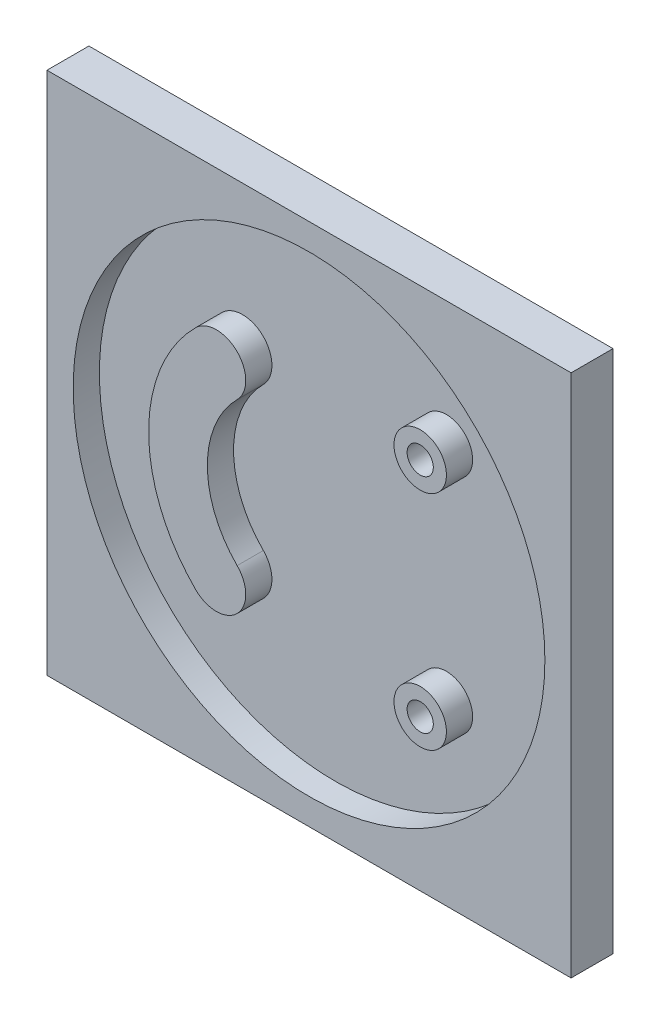
ISO-10303-21;
HEADER;
FILE_DESCRIPTION(('STEP AP214'),'2;1');
FILE_NAME('part.step','',(''),(''),'','','');
FILE_SCHEMA(('AUTOMOTIVE_DESIGN { 1 0 10303 214 1 1 1 1 }'));
ENDSEC;
DATA;
#1=APPLICATION_CONTEXT('core data for automotive mechanical design processes');
#2=APPLICATION_PROTOCOL_DEFINITION('international standard','automotive_design',2000,#1);
#3=PRODUCT_CONTEXT('',#1,'mechanical');
#4=PRODUCT('Part','Part','',(#3));
#5=PRODUCT_RELATED_PRODUCT_CATEGORY('part','',(#4));
#6=PRODUCT_DEFINITION_FORMATION('','',#4);
#7=PRODUCT_DEFINITION_CONTEXT('part definition',#1,'design');
#8=PRODUCT_DEFINITION('design','',#6,#7);
#9=PRODUCT_DEFINITION_SHAPE('','',#8);
#10=(LENGTH_UNIT() NAMED_UNIT(*) SI_UNIT(.MILLI.,.METRE.));
#11=(NAMED_UNIT(*) PLANE_ANGLE_UNIT() SI_UNIT($,.RADIAN.));
#12=(NAMED_UNIT(*) SI_UNIT($,.STERADIAN.) SOLID_ANGLE_UNIT());
#13=UNCERTAINTY_MEASURE_WITH_UNIT(LENGTH_MEASURE(1.E-05),#10,'distance_accuracy_value','');
#14=(GEOMETRIC_REPRESENTATION_CONTEXT(3) GLOBAL_UNCERTAINTY_ASSIGNED_CONTEXT((#13)) GLOBAL_UNIT_ASSIGNED_CONTEXT((#10,
#11,#12)) REPRESENTATION_CONTEXT('',''));
#15=CARTESIAN_POINT('',(0.,0.,0.));
#16=DIRECTION('',(0.,0.,1.));
#17=DIRECTION('',(1.,0.,0.));
#18=AXIS2_PLACEMENT_3D('',#15,#16,#17);
#19=CARTESIAN_POINT('',(0.,0.,10.16));
#20=DIRECTION('',(0.,0.,-1.));
#21=DIRECTION('',(-1.,0.,0.));
#22=AXIS2_PLACEMENT_3D('',#19,#20,#21);
#23=PLANE('',#22);
#24=CARTESIAN_POINT('',(63.5,63.5,10.16));
#25=DIRECTION('',(0.,0.,1.));
#26=DIRECTION('',(1.,0.,0.));
#27=AXIS2_PLACEMENT_3D('',#24,#25,#26);
#28=CIRCLE('',#27,57.15);
#29=CARTESIAN_POINT('',(120.65,63.5,10.16));
#30=VERTEX_POINT('',#29);
#31=EDGE_CURVE('E160',#30,#30,#28,.T.);
#32=ORIENTED_EDGE('',*,*,#31,.F.);
#33=EDGE_LOOP('',(#32));
#34=FACE_BOUND('',#33,.T.);
#35=DIRECTION('',(0.,-1.,0.));
#36=VECTOR('',#35,1.);
#37=CARTESIAN_POINT('',(0.,0.,10.16));
#38=LINE('',#37,#36);
#39=CARTESIAN_POINT('',(0.,127.,10.16));
#40=VERTEX_POINT('',#39);
#41=CARTESIAN_POINT('',(0.,0.,10.16));
#42=VERTEX_POINT('',#41);
#43=EDGE_CURVE('E208',#40,#42,#38,.T.);
#44=ORIENTED_EDGE('',*,*,#43,.T.);
#45=DIRECTION('',(1.,0.,0.));
#46=VECTOR('',#45,1.);
#47=CARTESIAN_POINT('',(0.,0.,10.16));
#48=LINE('',#47,#46);
#49=CARTESIAN_POINT('',(127.,0.,10.16));
#50=VERTEX_POINT('',#49);
#51=EDGE_CURVE('E100',#42,#50,#48,.T.);
#52=ORIENTED_EDGE('',*,*,#51,.T.);
#53=DIRECTION('',(0.,1.,0.));
#54=VECTOR('',#53,1.);
#55=CARTESIAN_POINT('',(127.,0.,10.16));
#56=LINE('',#55,#54);
#57=CARTESIAN_POINT('',(127.,127.,10.16));
#58=VERTEX_POINT('',#57);
#59=EDGE_CURVE('E224',#50,#58,#56,.T.);
#60=ORIENTED_EDGE('',*,*,#59,.T.);
#61=DIRECTION('',(-1.,0.,0.));
#62=VECTOR('',#61,1.);
#63=CARTESIAN_POINT('',(0.,127.,10.16));
#64=LINE('',#63,#62);
#65=EDGE_CURVE('E71',#58,#40,#64,.T.);
#66=ORIENTED_EDGE('',*,*,#65,.T.);
#67=EDGE_LOOP('',(#44,#52,#60,#66));
#68=FACE_BOUND('',#67,.T.);
#69=ADVANCED_FACE('F46',(#34,#68),#23,.F.);
#70=CARTESIAN_POINT('',(0.,0.,0.));
#71=DIRECTION('',(0.,0.,-1.));
#72=DIRECTION('',(-1.,0.,0.));
#73=AXIS2_PLACEMENT_3D('',#70,#71,#72);
#74=PLANE('',#73);
#75=CARTESIAN_POINT('',(90.4407683632075,90.4407683632075,0.));
#76=DIRECTION('',(0.,0.,1.));
#77=DIRECTION('',(1.,0.,0.));
#78=AXIS2_PLACEMENT_3D('',#75,#76,#77);
#79=CIRCLE('',#78,3.175);
#80=CARTESIAN_POINT('',(93.6157683632075,90.4407683632075,0.));
#81=VERTEX_POINT('',#80);
#82=EDGE_CURVE('E337',#81,#81,#79,.T.);
#83=ORIENTED_EDGE('',*,*,#82,.T.);
#84=EDGE_LOOP('',(#83));
#85=FACE_BOUND('',#84,.T.);
#86=CARTESIAN_POINT('',(90.4407683632075,36.5592316367925,0.));
#87=DIRECTION('',(0.,0.,1.));
#88=DIRECTION('',(1.,0.,0.));
#89=AXIS2_PLACEMENT_3D('',#86,#87,#88);
#90=CIRCLE('',#89,3.175);
#91=CARTESIAN_POINT('',(93.6157683632075,36.5592316367925,0.));
#92=VERTEX_POINT('',#91);
#93=EDGE_CURVE('E342',#92,#92,#90,.T.);
#94=ORIENTED_EDGE('',*,*,#93,.T.);
#95=EDGE_LOOP('',(#94));
#96=FACE_BOUND('',#95,.T.);
#97=DIRECTION('',(0.,-1.,0.));
#98=VECTOR('',#97,1.);
#99=CARTESIAN_POINT('',(0.,0.,0.));
#100=LINE('',#99,#98);
#101=CARTESIAN_POINT('',(0.,127.,0.));
#102=VERTEX_POINT('',#101);
#103=CARTESIAN_POINT('',(0.,0.,0.));
#104=VERTEX_POINT('',#103);
#105=EDGE_CURVE('E207',#102,#104,#100,.T.);
#106=ORIENTED_EDGE('',*,*,#105,.F.);
#107=DIRECTION('',(-1.,0.,0.));
#108=VECTOR('',#107,1.);
#109=CARTESIAN_POINT('',(0.,127.,0.));
#110=LINE('',#109,#108);
#111=CARTESIAN_POINT('',(127.,127.,0.));
#112=VERTEX_POINT('',#111);
#113=EDGE_CURVE('E92',#112,#102,#110,.T.);
#114=ORIENTED_EDGE('',*,*,#113,.F.);
#115=DIRECTION('',(0.,1.,0.));
#116=VECTOR('',#115,1.);
#117=CARTESIAN_POINT('',(127.,0.,0.));
#118=LINE('',#117,#116);
#119=CARTESIAN_POINT('',(127.,0.,0.));
#120=VERTEX_POINT('',#119);
#121=EDGE_CURVE('E258',#120,#112,#118,.T.);
#122=ORIENTED_EDGE('',*,*,#121,.F.);
#123=DIRECTION('',(1.,0.,0.));
#124=VECTOR('',#123,1.);
#125=CARTESIAN_POINT('',(0.,0.,0.));
#126=LINE('',#125,#124);
#127=EDGE_CURVE('E251',#104,#120,#126,.T.);
#128=ORIENTED_EDGE('',*,*,#127,.F.);
#129=EDGE_LOOP('',(#106,#114,#122,#128));
#130=FACE_BOUND('',#129,.T.);
#131=ADVANCED_FACE('F285',(#85,#96,#130),#74,.T.);
#132=CARTESIAN_POINT('',(0.,0.,10.16));
#133=DIRECTION('',(1.,0.,0.));
#134=DIRECTION('',(0.,1.,0.));
#135=AXIS2_PLACEMENT_3D('',#132,#133,#134);
#136=PLANE('',#135);
#137=ORIENTED_EDGE('',*,*,#105,.T.);
#138=DIRECTION('',(0.,0.,-1.));
#139=VECTOR('',#138,1.);
#140=CARTESIAN_POINT('',(0.,0.,10.16));
#141=LINE('',#140,#139);
#142=EDGE_CURVE('E55',#42,#104,#141,.T.);
#143=ORIENTED_EDGE('',*,*,#142,.F.);
#144=ORIENTED_EDGE('',*,*,#43,.F.);
#145=DIRECTION('',(0.,0.,-1.));
#146=VECTOR('',#145,1.);
#147=CARTESIAN_POINT('',(0.,127.,10.16));
#148=LINE('',#147,#146);
#149=EDGE_CURVE('E241',#40,#102,#148,.T.);
#150=ORIENTED_EDGE('',*,*,#149,.T.);
#151=EDGE_LOOP('',(#137,#143,#144,#150));
#152=FACE_BOUND('',#151,.T.);
#153=ADVANCED_FACE('F48',(#152),#136,.F.);
#154=CARTESIAN_POINT('',(0.,0.,10.16));
#155=DIRECTION('',(0.,1.,0.));
#156=DIRECTION('',(0.,0.,1.));
#157=AXIS2_PLACEMENT_3D('',#154,#155,#156);
#158=PLANE('',#157);
#159=ORIENTED_EDGE('',*,*,#127,.T.);
#160=DIRECTION('',(0.,0.,-1.));
#161=VECTOR('',#160,1.);
#162=CARTESIAN_POINT('',(127.,0.,10.16));
#163=LINE('',#162,#161);
#164=EDGE_CURVE('E240',#50,#120,#163,.T.);
#165=ORIENTED_EDGE('',*,*,#164,.F.);
#166=ORIENTED_EDGE('',*,*,#51,.F.);
#167=ORIENTED_EDGE('',*,*,#142,.T.);
#168=EDGE_LOOP('',(#159,#165,#166,#167));
#169=FACE_BOUND('',#168,.T.);
#170=ADVANCED_FACE('F250',(#169),#158,.F.);
#171=CARTESIAN_POINT('',(127.,0.,10.16));
#172=DIRECTION('',(-1.,0.,0.));
#173=DIRECTION('',(0.,-1.,0.));
#174=AXIS2_PLACEMENT_3D('',#171,#172,#173);
#175=PLANE('',#174);
#176=ORIENTED_EDGE('',*,*,#121,.T.);
#177=DIRECTION('',(0.,0.,-1.));
#178=VECTOR('',#177,1.);
#179=CARTESIAN_POINT('',(127.,127.,10.16));
#180=LINE('',#179,#178);
#181=EDGE_CURVE('E236',#58,#112,#180,.T.);
#182=ORIENTED_EDGE('',*,*,#181,.F.);
#183=ORIENTED_EDGE('',*,*,#59,.F.);
#184=ORIENTED_EDGE('',*,*,#164,.T.);
#185=EDGE_LOOP('',(#176,#182,#183,#184));
#186=FACE_BOUND('',#185,.T.);
#187=ADVANCED_FACE('F270',(#186),#175,.F.);
#188=CARTESIAN_POINT('',(0.,127.,10.16));
#189=DIRECTION('',(0.,-1.,0.));
#190=DIRECTION('',(0.,0.,-1.));
#191=AXIS2_PLACEMENT_3D('',#188,#189,#190);
#192=PLANE('',#191);
#193=ORIENTED_EDGE('',*,*,#113,.T.);
#194=ORIENTED_EDGE('',*,*,#149,.F.);
#195=ORIENTED_EDGE('',*,*,#65,.F.);
#196=ORIENTED_EDGE('',*,*,#181,.T.);
#197=EDGE_LOOP('',(#193,#194,#195,#196));
#198=FACE_BOUND('',#197,.T.);
#199=ADVANCED_FACE('F271',(#198),#192,.F.);
#200=CARTESIAN_POINT('',(63.5,63.5,3.81));
#201=DIRECTION('',(0.,0.,1.));
#202=DIRECTION('',(1.,0.,0.));
#203=AXIS2_PLACEMENT_3D('',#200,#201,#202);
#204=CYLINDRICAL_SURFACE('',#203,57.15);
#205=CARTESIAN_POINT('',(63.5,63.5,3.81));
#206=DIRECTION('',(0.,0.,1.));
#207=DIRECTION('',(1.,0.,0.));
#208=AXIS2_PLACEMENT_3D('',#205,#206,#207);
#209=CIRCLE('',#208,57.15);
#210=CARTESIAN_POINT('',(120.65,63.5,3.81));
#211=VERTEX_POINT('',#210);
#212=EDGE_CURVE('E155',#211,#211,#209,.T.);
#213=ORIENTED_EDGE('',*,*,#212,.F.);
#214=EDGE_LOOP('',(#213));
#215=FACE_BOUND('',#214,.T.);
#216=ORIENTED_EDGE('',*,*,#31,.T.);
#217=EDGE_LOOP('',(#216));
#218=FACE_BOUND('',#217,.T.);
#219=ADVANCED_FACE('F273',(#215,#218),#204,.F.);
#220=CARTESIAN_POINT('',(63.5,63.5,3.81));
#221=DIRECTION('',(0.,0.,1.));
#222=DIRECTION('',(1.,0.,0.));
#223=AXIS2_PLACEMENT_3D('',#220,#221,#222);
#224=PLANE('',#223);
#225=CARTESIAN_POINT('',(90.4407683632075,90.4407683632075,3.81));
#226=DIRECTION('',(0.,0.,1.));
#227=DIRECTION('',(1.,0.,0.));
#228=AXIS2_PLACEMENT_3D('',#225,#226,#227);
#229=CIRCLE('',#228,6.34999999999999);
#230=CARTESIAN_POINT('',(96.7907683632074,90.4407683632075,3.81));
#231=VERTEX_POINT('',#230);
#232=EDGE_CURVE('E202',#231,#231,#229,.T.);
#233=ORIENTED_EDGE('',*,*,#232,.F.);
#234=EDGE_LOOP('',(#233));
#235=FACE_BOUND('',#234,.T.);
#236=CARTESIAN_POINT('',(90.4407683632075,36.5592316367925,3.81));
#237=DIRECTION('',(0.,0.,1.));
#238=DIRECTION('',(1.,0.,0.));
#239=AXIS2_PLACEMENT_3D('',#236,#237,#238);
#240=CIRCLE('',#239,6.35);
#241=CARTESIAN_POINT('',(96.7907683632075,36.5592316367925,3.81));
#242=VERTEX_POINT('',#241);
#243=EDGE_CURVE('E189',#242,#242,#240,.T.);
#244=ORIENTED_EDGE('',*,*,#243,.F.);
#245=EDGE_LOOP('',(#244));
#246=FACE_BOUND('',#245,.T.);
#247=CARTESIAN_POINT('',(63.5,63.5,3.81));
#248=DIRECTION('',(0.,0.,1.));
#249=DIRECTION('',(1.,0.,0.));
#250=AXIS2_PLACEMENT_3D('',#247,#248,#249);
#251=CIRCLE('',#250,24.6380065369198);
#252=CARTESIAN_POINT('',(46.0782985028255,46.0782985028256,3.81));
#253=VERTEX_POINT('',#252);
#254=CARTESIAN_POINT('',(46.0782985028255,80.9217014971745,3.81));
#255=VERTEX_POINT('',#254);
#256=EDGE_CURVE('E12',#253,#255,#251,.F.);
#257=ORIENTED_EDGE('',*,*,#256,.F.);
#258=CARTESIAN_POINT('',(41.0493550750268,41.0493550750268,3.81));
#259=DIRECTION('',(0.,0.,1.));
#260=DIRECTION('',(1.,0.,0.));
#261=AXIS2_PLACEMENT_3D('',#258,#259,#260);
#262=CIRCLE('',#261,7.11200000000001);
#263=CARTESIAN_POINT('',(36.020411647228,36.0204116472281,3.81));
#264=VERTEX_POINT('',#263);
#265=EDGE_CURVE('E138',#264,#253,#262,.T.);
#266=ORIENTED_EDGE('',*,*,#265,.F.);
#267=CARTESIAN_POINT('',(63.5,63.5,3.81));
#268=DIRECTION('',(0.,0.,1.));
#269=DIRECTION('',(1.,0.,0.));
#270=AXIS2_PLACEMENT_3D('',#267,#268,#269);
#271=CIRCLE('',#270,38.8620065369198);
#272=CARTESIAN_POINT('',(36.020411647228,90.979588352772,3.81000000000001));
#273=VERTEX_POINT('',#272);
#274=EDGE_CURVE('E183',#273,#264,#271,.T.);
#275=ORIENTED_EDGE('',*,*,#274,.F.);
#276=CARTESIAN_POINT('',(41.0493550750268,85.9506449249732,3.81));
#277=DIRECTION('',(0.,0.,1.));
#278=DIRECTION('',(1.,0.,0.));
#279=AXIS2_PLACEMENT_3D('',#276,#277,#278);
#280=CIRCLE('',#279,7.11200000000001);
#281=EDGE_CURVE('E62',#255,#273,#280,.T.);
#282=ORIENTED_EDGE('',*,*,#281,.F.);
#283=EDGE_LOOP('',(#257,#266,#275,#282));
#284=FACE_BOUND('',#283,.T.);
#285=ORIENTED_EDGE('',*,*,#212,.T.);
#286=EDGE_LOOP('',(#285));
#287=FACE_BOUND('',#286,.T.);
#288=ADVANCED_FACE('F279',(#235,#246,#284,#287),#224,.T.);
#289=CARTESIAN_POINT('',(0.,0.,10.16));
#290=DIRECTION('',(0.,0.,-1.));
#291=DIRECTION('',(-1.,0.,0.));
#292=AXIS2_PLACEMENT_3D('',#289,#290,#291);
#293=PLANE('',#292);
#294=CARTESIAN_POINT('',(63.5,63.5,10.16));
#295=DIRECTION('',(0.,0.,-1.));
#296=DIRECTION('',(-1.,0.,0.));
#297=AXIS2_PLACEMENT_3D('',#294,#295,#296);
#298=CIRCLE('',#297,38.8620065369198);
#299=CARTESIAN_POINT('',(36.020411647228,36.0204116472281,10.16));
#300=VERTEX_POINT('',#299);
#301=CARTESIAN_POINT('',(36.020411647228,90.979588352772,10.16));
#302=VERTEX_POINT('',#301);
#303=EDGE_CURVE('E128',#300,#302,#298,.T.);
#304=ORIENTED_EDGE('',*,*,#303,.F.);
#305=CARTESIAN_POINT('',(41.0493550750268,41.0493550750268,10.16));
#306=DIRECTION('',(0.,0.,-1.));
#307=DIRECTION('',(-1.,0.,0.));
#308=AXIS2_PLACEMENT_3D('',#305,#306,#307);
#309=CIRCLE('',#308,7.11200000000001);
#310=CARTESIAN_POINT('',(46.0782985028255,46.0782985028255,10.16));
#311=VERTEX_POINT('',#310);
#312=EDGE_CURVE('E121',#311,#300,#309,.T.);
#313=ORIENTED_EDGE('',*,*,#312,.F.);
#314=CARTESIAN_POINT('',(63.5,63.5,10.16));
#315=DIRECTION('',(0.,0.,-1.));
#316=DIRECTION('',(-1.,0.,0.));
#317=AXIS2_PLACEMENT_3D('',#314,#315,#316);
#318=CIRCLE('',#317,24.6380065369198);
#319=CARTESIAN_POINT('',(46.0782985028255,80.9217014971745,10.16));
#320=VERTEX_POINT('',#319);
#321=EDGE_CURVE('E125',#320,#311,#318,.F.);
#322=ORIENTED_EDGE('',*,*,#321,.F.);
#323=CARTESIAN_POINT('',(41.0493550750268,85.9506449249732,10.16));
#324=DIRECTION('',(0.,0.,-1.));
#325=DIRECTION('',(-1.,0.,0.));
#326=AXIS2_PLACEMENT_3D('',#323,#324,#325);
#327=CIRCLE('',#326,7.112);
#328=EDGE_CURVE('E176',#302,#320,#327,.T.);
#329=ORIENTED_EDGE('',*,*,#328,.F.);
#330=EDGE_LOOP('',(#304,#313,#322,#329));
#331=FACE_BOUND('',#330,.T.);
#332=ADVANCED_FACE('F123',(#331),#293,.F.);
#333=CARTESIAN_POINT('',(41.0493550750268,85.9506449249732,73.7929194785732));
#334=DIRECTION('',(0.,0.,-1.));
#335=DIRECTION('',(-1.,0.,0.));
#336=AXIS2_PLACEMENT_3D('',#333,#334,#335);
#337=CYLINDRICAL_SURFACE('',#336,7.112);
#338=ORIENTED_EDGE('',*,*,#281,.T.);
#339=DIRECTION('',(0.,0.,-1.));
#340=VECTOR('',#339,1.);
#341=CARTESIAN_POINT('',(36.020411647228,90.979588352772,73.7929194785732));
#342=LINE('',#341,#340);
#343=EDGE_CURVE('E148',#302,#273,#342,.T.);
#344=ORIENTED_EDGE('',*,*,#343,.F.);
#345=ORIENTED_EDGE('',*,*,#328,.T.);
#346=DIRECTION('',(0.,0.,-1.));
#347=VECTOR('',#346,1.);
#348=CARTESIAN_POINT('',(46.0782985028255,80.9217014971745,73.7929194785732));
#349=LINE('',#348,#347);
#350=EDGE_CURVE('E142',#320,#255,#349,.T.);
#351=ORIENTED_EDGE('',*,*,#350,.T.);
#352=EDGE_LOOP('',(#338,#344,#345,#351));
#353=FACE_BOUND('',#352,.T.);
#354=ADVANCED_FACE('F297',(#353),#337,.T.);
#355=CARTESIAN_POINT('',(63.5,63.5,73.7929194785732));
#356=DIRECTION('',(0.,0.,-1.));
#357=DIRECTION('',(-1.,0.,0.));
#358=AXIS2_PLACEMENT_3D('',#355,#356,#357);
#359=CYLINDRICAL_SURFACE('',#358,38.8620065369198);
#360=ORIENTED_EDGE('',*,*,#274,.T.);
#361=DIRECTION('',(0.,0.,-1.));
#362=VECTOR('',#361,1.);
#363=CARTESIAN_POINT('',(36.020411647228,36.0204116472281,73.7929194785732));
#364=LINE('',#363,#362);
#365=EDGE_CURVE('E141',#300,#264,#364,.T.);
#366=ORIENTED_EDGE('',*,*,#365,.F.);
#367=ORIENTED_EDGE('',*,*,#303,.T.);
#368=ORIENTED_EDGE('',*,*,#343,.T.);
#369=EDGE_LOOP('',(#360,#366,#367,#368));
#370=FACE_BOUND('',#369,.T.);
#371=ADVANCED_FACE('F182',(#370),#359,.T.);
#372=CARTESIAN_POINT('',(41.0493550750268,41.0493550750268,73.7929194785732));
#373=DIRECTION('',(0.,0.,-1.));
#374=DIRECTION('',(-1.,0.,0.));
#375=AXIS2_PLACEMENT_3D('',#372,#373,#374);
#376=CYLINDRICAL_SURFACE('',#375,7.11200000000001);
#377=ORIENTED_EDGE('',*,*,#265,.T.);
#378=DIRECTION('',(0.,0.,-1.));
#379=VECTOR('',#378,1.);
#380=CARTESIAN_POINT('',(46.0782985028255,46.0782985028255,73.7929194785732));
#381=LINE('',#380,#379);
#382=EDGE_CURVE('E136',#311,#253,#381,.T.);
#383=ORIENTED_EDGE('',*,*,#382,.F.);
#384=ORIENTED_EDGE('',*,*,#312,.T.);
#385=ORIENTED_EDGE('',*,*,#365,.T.);
#386=EDGE_LOOP('',(#377,#383,#384,#385));
#387=FACE_BOUND('',#386,.T.);
#388=ADVANCED_FACE('F137',(#387),#376,.T.);
#389=CARTESIAN_POINT('',(63.5,63.5,73.7929194785732));
#390=DIRECTION('',(0.,0.,-1.));
#391=DIRECTION('',(-1.,0.,0.));
#392=AXIS2_PLACEMENT_3D('',#389,#390,#391);
#393=CYLINDRICAL_SURFACE('',#392,24.6380065369198);
#394=ORIENTED_EDGE('',*,*,#256,.T.);
#395=ORIENTED_EDGE('',*,*,#350,.F.);
#396=ORIENTED_EDGE('',*,*,#321,.T.);
#397=ORIENTED_EDGE('',*,*,#382,.T.);
#398=EDGE_LOOP('',(#394,#395,#396,#397));
#399=FACE_BOUND('',#398,.T.);
#400=ADVANCED_FACE('F145',(#399),#393,.F.);
#401=CARTESIAN_POINT('',(0.,0.,10.16));
#402=DIRECTION('',(0.,0.,-1.));
#403=DIRECTION('',(-1.,0.,0.));
#404=AXIS2_PLACEMENT_3D('',#401,#402,#403);
#405=PLANE('',#404);
#406=CARTESIAN_POINT('',(90.4407683632075,36.5592316367925,10.16));
#407=DIRECTION('',(0.,0.,1.));
#408=DIRECTION('',(1.,0.,0.));
#409=AXIS2_PLACEMENT_3D('',#406,#407,#408);
#410=CIRCLE('',#409,3.175);
#411=CARTESIAN_POINT('',(93.6157683632075,36.5592316367925,10.16));
#412=VERTEX_POINT('',#411);
#413=EDGE_CURVE('E349',#412,#412,#410,.T.);
#414=ORIENTED_EDGE('',*,*,#413,.F.);
#415=EDGE_LOOP('',(#414));
#416=FACE_BOUND('',#415,.T.);
#417=CARTESIAN_POINT('',(90.4407683632075,36.5592316367925,10.16));
#418=DIRECTION('',(0.,0.,-1.));
#419=DIRECTION('',(-1.,0.,0.));
#420=AXIS2_PLACEMENT_3D('',#417,#418,#419);
#421=CIRCLE('',#420,6.35);
#422=CARTESIAN_POINT('',(84.0907683632075,36.5592316367925,10.16));
#423=VERTEX_POINT('',#422);
#424=EDGE_CURVE('E175',#423,#423,#421,.T.);
#425=ORIENTED_EDGE('',*,*,#424,.F.);
#426=EDGE_LOOP('',(#425));
#427=FACE_BOUND('',#426,.T.);
#428=ADVANCED_FACE('F307',(#416,#427),#405,.F.);
#429=CARTESIAN_POINT('',(90.4407683632075,36.5592316367925,73.7929194785732));
#430=DIRECTION('',(0.,0.,-1.));
#431=DIRECTION('',(-1.,0.,0.));
#432=AXIS2_PLACEMENT_3D('',#429,#430,#431);
#433=CYLINDRICAL_SURFACE('',#432,6.35);
#434=ORIENTED_EDGE('',*,*,#243,.T.);
#435=EDGE_LOOP('',(#434));
#436=FACE_BOUND('',#435,.T.);
#437=ORIENTED_EDGE('',*,*,#424,.T.);
#438=EDGE_LOOP('',(#437));
#439=FACE_BOUND('',#438,.T.);
#440=ADVANCED_FACE('F310',(#436,#439),#433,.T.);
#441=CARTESIAN_POINT('',(0.,0.,10.16));
#442=DIRECTION('',(0.,0.,-1.));
#443=DIRECTION('',(-1.,0.,0.));
#444=AXIS2_PLACEMENT_3D('',#441,#442,#443);
#445=PLANE('',#444);
#446=CARTESIAN_POINT('',(90.4407683632075,90.4407683632075,10.16));
#447=DIRECTION('',(0.,0.,1.));
#448=DIRECTION('',(1.,0.,0.));
#449=AXIS2_PLACEMENT_3D('',#446,#447,#448);
#450=CIRCLE('',#449,3.175);
#451=CARTESIAN_POINT('',(93.6157683632075,90.4407683632075,10.16));
#452=VERTEX_POINT('',#451);
#453=EDGE_CURVE('E340',#452,#452,#450,.T.);
#454=ORIENTED_EDGE('',*,*,#453,.F.);
#455=EDGE_LOOP('',(#454));
#456=FACE_BOUND('',#455,.T.);
#457=CARTESIAN_POINT('',(90.4407683632075,90.4407683632075,10.16));
#458=DIRECTION('',(0.,0.,-1.));
#459=DIRECTION('',(-1.,0.,0.));
#460=AXIS2_PLACEMENT_3D('',#457,#458,#459);
#461=CIRCLE('',#460,6.34999999999999);
#462=CARTESIAN_POINT('',(84.0907683632075,90.4407683632075,10.16));
#463=VERTEX_POINT('',#462);
#464=EDGE_CURVE('E346',#463,#463,#461,.T.);
#465=ORIENTED_EDGE('',*,*,#464,.F.);
#466=EDGE_LOOP('',(#465));
#467=FACE_BOUND('',#466,.T.);
#468=ADVANCED_FACE('F313',(#456,#467),#445,.F.);
#469=CARTESIAN_POINT('',(90.4407683632075,90.4407683632075,73.7929194785732));
#470=DIRECTION('',(0.,0.,-1.));
#471=DIRECTION('',(-1.,0.,0.));
#472=AXIS2_PLACEMENT_3D('',#469,#470,#471);
#473=CYLINDRICAL_SURFACE('',#472,6.34999999999999);
#474=ORIENTED_EDGE('',*,*,#232,.T.);
#475=EDGE_LOOP('',(#474));
#476=FACE_BOUND('',#475,.T.);
#477=ORIENTED_EDGE('',*,*,#464,.T.);
#478=EDGE_LOOP('',(#477));
#479=FACE_BOUND('',#478,.T.);
#480=ADVANCED_FACE('F318',(#476,#479),#473,.T.);
#481=CARTESIAN_POINT('',(90.4407683632075,90.4407683632075,0.));
#482=DIRECTION('',(0.,0.,1.));
#483=DIRECTION('',(1.,0.,0.));
#484=AXIS2_PLACEMENT_3D('',#481,#482,#483);
#485=CYLINDRICAL_SURFACE('',#484,3.175);
#486=ORIENTED_EDGE('',*,*,#82,.F.);
#487=EDGE_LOOP('',(#486));
#488=FACE_BOUND('',#487,.T.);
#489=ORIENTED_EDGE('',*,*,#453,.T.);
#490=EDGE_LOOP('',(#489));
#491=FACE_BOUND('',#490,.T.);
#492=ADVANCED_FACE('F321',(#488,#491),#485,.F.);
#493=CARTESIAN_POINT('',(90.4407683632075,36.5592316367925,0.));
#494=DIRECTION('',(0.,0.,1.));
#495=DIRECTION('',(1.,0.,0.));
#496=AXIS2_PLACEMENT_3D('',#493,#494,#495);
#497=CYLINDRICAL_SURFACE('',#496,3.175);
#498=ORIENTED_EDGE('',*,*,#93,.F.);
#499=EDGE_LOOP('',(#498));
#500=FACE_BOUND('',#499,.T.);
#501=ORIENTED_EDGE('',*,*,#413,.T.);
#502=EDGE_LOOP('',(#501));
#503=FACE_BOUND('',#502,.T.);
#504=ADVANCED_FACE('F326',(#500,#503),#497,.F.);
#505=CLOSED_SHELL('',(#69,#131,#153,#170,#187,#199,#219,#288,#332,#354,#371,#388,#400,#428,#440,
#468,#480,#492,#504));
#506=MANIFOLD_SOLID_BREP('B2',#505);
#507=ADVANCED_BREP_SHAPE_REPRESENTATION('',(#18,#506),#14);
#508=SHAPE_DEFINITION_REPRESENTATION(#9,#507);
ENDSEC;
END-ISO-10303-21;
